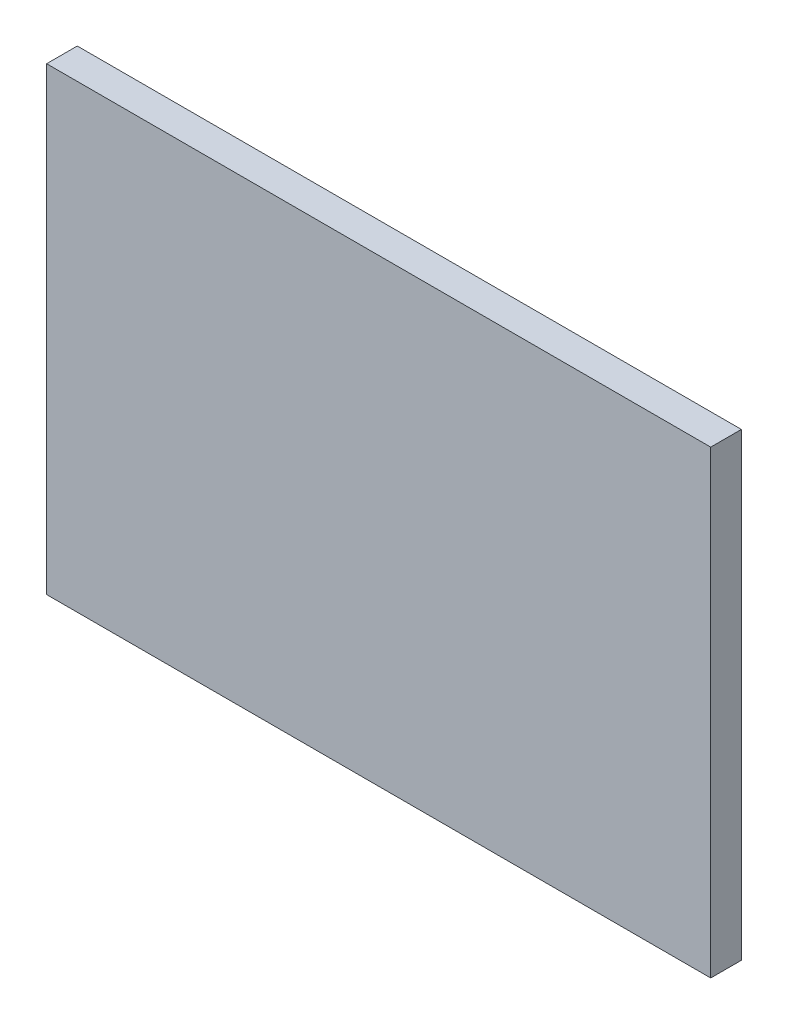
ISO-10303-21;
HEADER;
FILE_DESCRIPTION(('STEP AP214'),'2;1');
FILE_NAME('part.step','',(''),(''),'','','');
FILE_SCHEMA(('AUTOMOTIVE_DESIGN { 1 0 10303 214 1 1 1 1 }'));
ENDSEC;
DATA;
#1=APPLICATION_CONTEXT('core data for automotive mechanical design processes');
#2=APPLICATION_PROTOCOL_DEFINITION('international standard','automotive_design',2000,#1);
#3=PRODUCT_CONTEXT('',#1,'mechanical');
#4=PRODUCT('Part','Part','',(#3));
#5=PRODUCT_RELATED_PRODUCT_CATEGORY('part','',(#4));
#6=PRODUCT_DEFINITION_FORMATION('','',#4);
#7=PRODUCT_DEFINITION_CONTEXT('part definition',#1,'design');
#8=PRODUCT_DEFINITION('design','',#6,#7);
#9=PRODUCT_DEFINITION_SHAPE('','',#8);
#10=(LENGTH_UNIT() NAMED_UNIT(*) SI_UNIT(.MILLI.,.METRE.));
#11=(NAMED_UNIT(*) PLANE_ANGLE_UNIT() SI_UNIT($,.RADIAN.));
#12=(NAMED_UNIT(*) SI_UNIT($,.STERADIAN.) SOLID_ANGLE_UNIT());
#13=UNCERTAINTY_MEASURE_WITH_UNIT(LENGTH_MEASURE(1.E-05),#10,'distance_accuracy_value','');
#14=(GEOMETRIC_REPRESENTATION_CONTEXT(3) GLOBAL_UNCERTAINTY_ASSIGNED_CONTEXT((#13)) GLOBAL_UNIT_ASSIGNED_CONTEXT((#10,
#11,#12)) REPRESENTATION_CONTEXT('',''));
#15=CARTESIAN_POINT('',(0.,0.,0.));
#16=DIRECTION('',(0.,0.,1.));
#17=DIRECTION('',(1.,0.,0.));
#18=AXIS2_PLACEMENT_3D('',#15,#16,#17);
#19=CARTESIAN_POINT('',(-58.2414734805805,45.,-28.3212430960497));
#20=DIRECTION('',(1.,0.,0.));
#21=DIRECTION('',(0.,0.,-1.));
#22=AXIS2_PLACEMENT_3D('',#19,#20,#21);
#23=PLANE('',#22);
#24=DIRECTION('',(0.,0.,1.));
#25=VECTOR('',#24,1.);
#26=CARTESIAN_POINT('',(-58.2414734805805,0.,-28.3212430960497));
#27=LINE('',#26,#25);
#28=CARTESIAN_POINT('',(-58.2414734805805,0.,-31.3212430960497));
#29=VERTEX_POINT('',#28);
#30=CARTESIAN_POINT('',(-58.2414734805805,0.,-28.3212430960497));
#31=VERTEX_POINT('',#30);
#32=EDGE_CURVE('E107',#29,#31,#27,.T.);
#33=ORIENTED_EDGE('',*,*,#32,.T.);
#34=DIRECTION('',(0.,-1.,0.));
#35=VECTOR('',#34,1.);
#36=CARTESIAN_POINT('',(-58.2414734805805,45.,-28.3212430960497));
#37=LINE('',#36,#35);
#38=CARTESIAN_POINT('',(-58.2414734805805,45.,-28.3212430960497));
#39=VERTEX_POINT('',#38);
#40=EDGE_CURVE('E11',#39,#31,#37,.T.);
#41=ORIENTED_EDGE('',*,*,#40,.F.);
#42=DIRECTION('',(0.,0.,1.));
#43=VECTOR('',#42,1.);
#44=CARTESIAN_POINT('',(-58.2414734805805,45.,-28.3212430960497));
#45=LINE('',#44,#43);
#46=CARTESIAN_POINT('',(-58.2414734805805,45.,-31.3212430960497));
#47=VERTEX_POINT('',#46);
#48=EDGE_CURVE('E91',#47,#39,#45,.T.);
#49=ORIENTED_EDGE('',*,*,#48,.F.);
#50=DIRECTION('',(0.,-1.,0.));
#51=VECTOR('',#50,1.);
#52=CARTESIAN_POINT('',(-58.2414734805805,45.,-31.3212430960497));
#53=LINE('',#52,#51);
#54=EDGE_CURVE('E103',#47,#29,#53,.T.);
#55=ORIENTED_EDGE('',*,*,#54,.T.);
#56=EDGE_LOOP('',(#33,#41,#49,#55));
#57=FACE_BOUND('',#56,.T.);
#58=ADVANCED_FACE('F39',(#57),#23,.F.);
#59=CARTESIAN_POINT('',(-58.2414734805805,45.,-28.3212430960497));
#60=DIRECTION('',(0.,0.,-1.));
#61=DIRECTION('',(-1.,0.,0.));
#62=AXIS2_PLACEMENT_3D('',#59,#60,#61);
#63=PLANE('',#62);
#64=DIRECTION('',(1.,0.,0.));
#65=VECTOR('',#64,1.);
#66=CARTESIAN_POINT('',(-58.2414734805805,0.,-28.3212430960497));
#67=LINE('',#66,#65);
#68=CARTESIAN_POINT('',(6.75852651941949,0.,-28.3212430960497));
#69=VERTEX_POINT('',#68);
#70=EDGE_CURVE('E96',#31,#69,#67,.T.);
#71=ORIENTED_EDGE('',*,*,#70,.T.);
#72=DIRECTION('',(0.,-1.,0.));
#73=VECTOR('',#72,1.);
#74=CARTESIAN_POINT('',(6.75852651941949,45.,-28.3212430960497));
#75=LINE('',#74,#73);
#76=CARTESIAN_POINT('',(6.75852651941949,45.,-28.3212430960497));
#77=VERTEX_POINT('',#76);
#78=EDGE_CURVE('E48',#77,#69,#75,.T.);
#79=ORIENTED_EDGE('',*,*,#78,.F.);
#80=DIRECTION('',(1.,0.,0.));
#81=VECTOR('',#80,1.);
#82=CARTESIAN_POINT('',(-58.2414734805805,45.,-28.3212430960497));
#83=LINE('',#82,#81);
#84=EDGE_CURVE('E86',#39,#77,#83,.T.);
#85=ORIENTED_EDGE('',*,*,#84,.F.);
#86=ORIENTED_EDGE('',*,*,#40,.T.);
#87=EDGE_LOOP('',(#71,#79,#85,#86));
#88=FACE_BOUND('',#87,.T.);
#89=ADVANCED_FACE('F95',(#88),#63,.F.);
#90=CARTESIAN_POINT('',(6.75852651941949,45.,-28.3212430960497));
#91=DIRECTION('',(-1.,0.,0.));
#92=DIRECTION('',(0.,0.,1.));
#93=AXIS2_PLACEMENT_3D('',#90,#91,#92);
#94=PLANE('',#93);
#95=DIRECTION('',(0.,0.,-1.));
#96=VECTOR('',#95,1.);
#97=CARTESIAN_POINT('',(6.75852651941949,0.,-28.3212430960497));
#98=LINE('',#97,#96);
#99=CARTESIAN_POINT('',(6.75852651941949,0.,-31.3212430960497));
#100=VERTEX_POINT('',#99);
#101=EDGE_CURVE('E73',#69,#100,#98,.T.);
#102=ORIENTED_EDGE('',*,*,#101,.T.);
#103=DIRECTION('',(0.,-1.,0.));
#104=VECTOR('',#103,1.);
#105=CARTESIAN_POINT('',(6.75852651941949,45.,-31.3212430960497));
#106=LINE('',#105,#104);
#107=CARTESIAN_POINT('',(6.75852651941949,45.,-31.3212430960497));
#108=VERTEX_POINT('',#107);
#109=EDGE_CURVE('E98',#108,#100,#106,.T.);
#110=ORIENTED_EDGE('',*,*,#109,.F.);
#111=DIRECTION('',(0.,0.,-1.));
#112=VECTOR('',#111,1.);
#113=CARTESIAN_POINT('',(6.75852651941949,45.,-28.3212430960497));
#114=LINE('',#113,#112);
#115=EDGE_CURVE('E89',#77,#108,#114,.T.);
#116=ORIENTED_EDGE('',*,*,#115,.F.);
#117=ORIENTED_EDGE('',*,*,#78,.T.);
#118=EDGE_LOOP('',(#102,#110,#116,#117));
#119=FACE_BOUND('',#118,.T.);
#120=ADVANCED_FACE('F99',(#119),#94,.F.);
#121=CARTESIAN_POINT('',(-58.2414734805805,45.,-31.3212430960497));
#122=DIRECTION('',(0.,0.,1.));
#123=DIRECTION('',(1.,0.,0.));
#124=AXIS2_PLACEMENT_3D('',#121,#122,#123);
#125=PLANE('',#124);
#126=DIRECTION('',(-1.,0.,0.));
#127=VECTOR('',#126,1.);
#128=CARTESIAN_POINT('',(-58.2414734805805,0.,-31.3212430960497));
#129=LINE('',#128,#127);
#130=EDGE_CURVE('E79',#100,#29,#129,.T.);
#131=ORIENTED_EDGE('',*,*,#130,.T.);
#132=ORIENTED_EDGE('',*,*,#54,.F.);
#133=DIRECTION('',(-1.,0.,0.));
#134=VECTOR('',#133,1.);
#135=CARTESIAN_POINT('',(-58.2414734805805,45.,-31.3212430960497));
#136=LINE('',#135,#134);
#137=EDGE_CURVE('E56',#108,#47,#136,.T.);
#138=ORIENTED_EDGE('',*,*,#137,.F.);
#139=ORIENTED_EDGE('',*,*,#109,.T.);
#140=EDGE_LOOP('',(#131,#132,#138,#139));
#141=FACE_BOUND('',#140,.T.);
#142=ADVANCED_FACE('F120',(#141),#125,.F.);
#143=CARTESIAN_POINT('',(0.,45.,0.));
#144=DIRECTION('',(0.,-1.,0.));
#145=DIRECTION('',(0.,0.,-1.));
#146=AXIS2_PLACEMENT_3D('',#143,#144,#145);
#147=PLANE('',#146);
#148=ORIENTED_EDGE('',*,*,#48,.T.);
#149=ORIENTED_EDGE('',*,*,#84,.T.);
#150=ORIENTED_EDGE('',*,*,#115,.T.);
#151=ORIENTED_EDGE('',*,*,#137,.T.);
#152=EDGE_LOOP('',(#148,#149,#150,#151));
#153=FACE_BOUND('',#152,.T.);
#154=ADVANCED_FACE('F87',(#153),#147,.F.);
#155=CARTESIAN_POINT('',(0.,0.,0.));
#156=DIRECTION('',(0.,-1.,0.));
#157=DIRECTION('',(0.,0.,-1.));
#158=AXIS2_PLACEMENT_3D('',#155,#156,#157);
#159=PLANE('',#158);
#160=ORIENTED_EDGE('',*,*,#32,.F.);
#161=ORIENTED_EDGE('',*,*,#130,.F.);
#162=ORIENTED_EDGE('',*,*,#101,.F.);
#163=ORIENTED_EDGE('',*,*,#70,.F.);
#164=EDGE_LOOP('',(#160,#161,#162,#163));
#165=FACE_BOUND('',#164,.T.);
#166=ADVANCED_FACE('F123',(#165),#159,.T.);
#167=CLOSED_SHELL('',(#58,#89,#120,#142,#154,#166));
#168=MANIFOLD_SOLID_BREP('B2',#167);
#169=ADVANCED_BREP_SHAPE_REPRESENTATION('',(#18,#168),#14);
#170=SHAPE_DEFINITION_REPRESENTATION(#9,#169);
ENDSEC;
END-ISO-10303-21;
